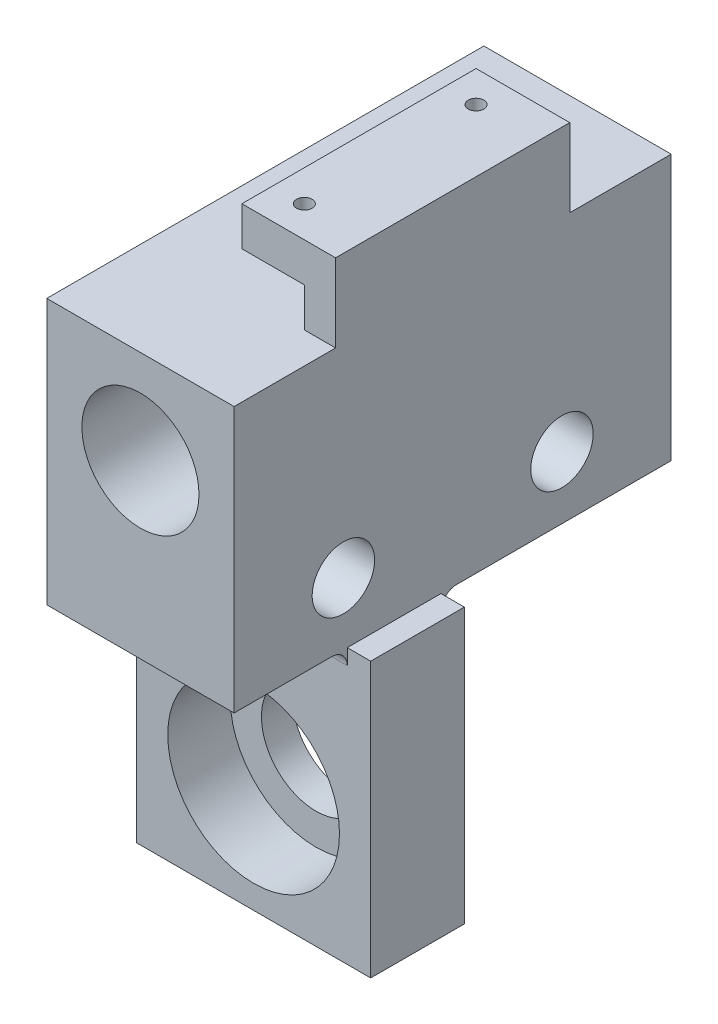
ISO-10303-21;
HEADER;
FILE_DESCRIPTION(('STEP AP214'),'2;1');
FILE_NAME('part.step','',(''),(''),'','','');
FILE_SCHEMA(('AUTOMOTIVE_DESIGN { 1 0 10303 214 1 1 1 1 }'));
ENDSEC;
DATA;
#1=APPLICATION_CONTEXT('core data for automotive mechanical design processes');
#2=APPLICATION_PROTOCOL_DEFINITION('international standard','automotive_design',2000,#1);
#3=PRODUCT_CONTEXT('',#1,'mechanical');
#4=PRODUCT('Part','Part','',(#3));
#5=PRODUCT_RELATED_PRODUCT_CATEGORY('part','',(#4));
#6=PRODUCT_DEFINITION_FORMATION('','',#4);
#7=PRODUCT_DEFINITION_CONTEXT('part definition',#1,'design');
#8=PRODUCT_DEFINITION('design','',#6,#7);
#9=PRODUCT_DEFINITION_SHAPE('','',#8);
#10=(LENGTH_UNIT() NAMED_UNIT(*) SI_UNIT(.MILLI.,.METRE.));
#11=(NAMED_UNIT(*) PLANE_ANGLE_UNIT() SI_UNIT($,.RADIAN.));
#12=(NAMED_UNIT(*) SI_UNIT($,.STERADIAN.) SOLID_ANGLE_UNIT());
#13=UNCERTAINTY_MEASURE_WITH_UNIT(LENGTH_MEASURE(1.E-05),#10,'distance_accuracy_value','');
#14=(GEOMETRIC_REPRESENTATION_CONTEXT(3) GLOBAL_UNCERTAINTY_ASSIGNED_CONTEXT((#13)) GLOBAL_UNIT_ASSIGNED_CONTEXT((#10,
#11,#12)) REPRESENTATION_CONTEXT('',''));
#15=CARTESIAN_POINT('',(0.,0.,0.));
#16=DIRECTION('',(0.,0.,1.));
#17=DIRECTION('',(1.,0.,0.));
#18=AXIS2_PLACEMENT_3D('',#15,#16,#17);
#19=CARTESIAN_POINT('',(-12.,12.,28.));
#20=DIRECTION('',(0.,-1.,0.));
#21=DIRECTION('',(0.,0.,-1.));
#22=AXIS2_PLACEMENT_3D('',#19,#20,#21);
#23=PLANE('',#22);
#24=DIRECTION('',(-1.,0.,0.));
#25=VECTOR('',#24,1.);
#26=CARTESIAN_POINT('',(-12.,12.,-28.));
#27=LINE('',#26,#25);
#28=CARTESIAN_POINT('',(12.,12.,-28.));
#29=VERTEX_POINT('',#28);
#30=CARTESIAN_POINT('',(-12.,12.,-28.));
#31=VERTEX_POINT('',#30);
#32=EDGE_CURVE('E260',#29,#31,#27,.T.);
#33=ORIENTED_EDGE('',*,*,#32,.T.);
#34=DIRECTION('',(0.,0.,-1.));
#35=VECTOR('',#34,1.);
#36=CARTESIAN_POINT('',(-12.,12.,28.));
#37=LINE('',#36,#35);
#38=CARTESIAN_POINT('',(-12.,12.,28.));
#39=VERTEX_POINT('',#38);
#40=EDGE_CURVE('E266',#39,#31,#37,.T.);
#41=ORIENTED_EDGE('',*,*,#40,.F.);
#42=DIRECTION('',(-1.,0.,0.));
#43=VECTOR('',#42,1.);
#44=CARTESIAN_POINT('',(-12.,12.,28.));
#45=LINE('',#44,#43);
#46=CARTESIAN_POINT('',(12.,12.,28.));
#47=VERTEX_POINT('',#46);
#48=EDGE_CURVE('E264',#47,#39,#45,.T.);
#49=ORIENTED_EDGE('',*,*,#48,.F.);
#50=DIRECTION('',(0.,0.,-1.));
#51=VECTOR('',#50,1.);
#52=CARTESIAN_POINT('',(12.,12.,28.));
#53=LINE('',#52,#51);
#54=CARTESIAN_POINT('',(12.,12.,15.));
#55=VERTEX_POINT('',#54);
#56=EDGE_CURVE('E187',#47,#55,#53,.T.);
#57=ORIENTED_EDGE('',*,*,#56,.T.);
#58=DIRECTION('',(1.,0.,0.));
#59=VECTOR('',#58,1.);
#60=CARTESIAN_POINT('',(0.,12.,15.));
#61=LINE('',#60,#59);
#62=CARTESIAN_POINT('',(8.,12.,15.));
#63=VERTEX_POINT('',#62);
#64=EDGE_CURVE('E181',#63,#55,#61,.T.);
#65=ORIENTED_EDGE('',*,*,#64,.F.);
#66=DIRECTION('',(0.,0.,1.));
#67=VECTOR('',#66,1.);
#68=CARTESIAN_POINT('',(8.,12.,-28.));
#69=LINE('',#68,#67);
#70=CARTESIAN_POINT('',(8.,12.,-15.));
#71=VERTEX_POINT('',#70);
#72=EDGE_CURVE('E48',#71,#63,#69,.T.);
#73=ORIENTED_EDGE('',*,*,#72,.F.);
#74=DIRECTION('',(-1.,0.,0.));
#75=VECTOR('',#74,1.);
#76=CARTESIAN_POINT('',(0.,12.,-15.));
#77=LINE('',#76,#75);
#78=CARTESIAN_POINT('',(12.,12.,-15.));
#79=VERTEX_POINT('',#78);
#80=EDGE_CURVE('E53',#79,#71,#77,.T.);
#81=ORIENTED_EDGE('',*,*,#80,.F.);
#82=EDGE_CURVE('E278',#79,#29,#53,.T.);
#83=ORIENTED_EDGE('',*,*,#82,.T.);
#84=EDGE_LOOP('',(#33,#41,#49,#57,#65,#73,#81,#83));
#85=FACE_BOUND('',#84,.T.);
#86=ADVANCED_FACE('F33',(#85),#23,.F.);
#87=CARTESIAN_POINT('',(-12.,-22.,28.));
#88=DIRECTION('',(0.,1.,0.));
#89=DIRECTION('',(0.,0.,1.));
#90=AXIS2_PLACEMENT_3D('',#87,#88,#89);
#91=PLANE('',#90);
#92=DIRECTION('',(0.,0.,-1.));
#93=VECTOR('',#92,1.);
#94=CARTESIAN_POINT('',(-12.,-22.,28.));
#95=LINE('',#94,#93);
#96=CARTESIAN_POINT('',(-12.,-22.,28.));
#97=VERTEX_POINT('',#96);
#98=CARTESIAN_POINT('',(-12.,-22.,15.5));
#99=VERTEX_POINT('',#98);
#100=EDGE_CURVE('E286',#97,#99,#95,.T.);
#101=ORIENTED_EDGE('',*,*,#100,.T.);
#102=DIRECTION('',(-1.,0.,0.));
#103=VECTOR('',#102,1.);
#104=CARTESIAN_POINT('',(12.,-22.,15.5));
#105=LINE('',#104,#103);
#106=CARTESIAN_POINT('',(12.,-22.,15.5));
#107=VERTEX_POINT('',#106);
#108=EDGE_CURVE('E308',#99,#107,#105,.F.);
#109=ORIENTED_EDGE('',*,*,#108,.T.);
#110=DIRECTION('',(0.,0.,-1.));
#111=VECTOR('',#110,1.);
#112=CARTESIAN_POINT('',(12.,-22.,28.));
#113=LINE('',#112,#111);
#114=CARTESIAN_POINT('',(12.,-22.,28.));
#115=VERTEX_POINT('',#114);
#116=EDGE_CURVE('E281',#115,#107,#113,.T.);
#117=ORIENTED_EDGE('',*,*,#116,.F.);
#118=DIRECTION('',(1.,0.,0.));
#119=VECTOR('',#118,1.);
#120=CARTESIAN_POINT('',(-12.,-22.,28.));
#121=LINE('',#120,#119);
#122=EDGE_CURVE('E259',#97,#115,#121,.T.);
#123=ORIENTED_EDGE('',*,*,#122,.F.);
#124=EDGE_LOOP('',(#101,#109,#117,#123));
#125=FACE_BOUND('',#124,.T.);
#126=ADVANCED_FACE('F368',(#125),#91,.F.);
#127=CARTESIAN_POINT('',(12.,-22.,-0.5));
#128=VERTEX_POINT('',#127);
#129=CARTESIAN_POINT('',(12.,-22.,-28.));
#130=VERTEX_POINT('',#129);
#131=EDGE_CURVE('E280',#128,#130,#113,.T.);
#132=ORIENTED_EDGE('',*,*,#131,.F.);
#133=DIRECTION('',(1.,0.,0.));
#134=VECTOR('',#133,1.);
#135=CARTESIAN_POINT('',(-12.,-22.,-0.5));
#136=LINE('',#135,#134);
#137=CARTESIAN_POINT('',(-12.,-22.,-0.5));
#138=VERTEX_POINT('',#137);
#139=EDGE_CURVE('E298',#128,#138,#136,.F.);
#140=ORIENTED_EDGE('',*,*,#139,.T.);
#141=CARTESIAN_POINT('',(-12.,-22.,-28.));
#142=VERTEX_POINT('',#141);
#143=EDGE_CURVE('E284',#138,#142,#95,.T.);
#144=ORIENTED_EDGE('',*,*,#143,.T.);
#145=DIRECTION('',(1.,0.,0.));
#146=VECTOR('',#145,1.);
#147=CARTESIAN_POINT('',(-12.,-22.,-28.));
#148=LINE('',#147,#146);
#149=EDGE_CURVE('E269',#142,#130,#148,.T.);
#150=ORIENTED_EDGE('',*,*,#149,.T.);
#151=EDGE_LOOP('',(#132,#140,#144,#150));
#152=FACE_BOUND('',#151,.T.);
#153=ADVANCED_FACE('F341',(#152),#91,.F.);
#154=CARTESIAN_POINT('',(0.,0.,28.));
#155=DIRECTION('',(0.,0.,1.));
#156=DIRECTION('',(1.,0.,0.));
#157=AXIS2_PLACEMENT_3D('',#154,#155,#156);
#158=PLANE('',#157);
#159=DIRECTION('',(0.,-1.,0.));
#160=VECTOR('',#159,1.);
#161=CARTESIAN_POINT('',(-12.,12.,28.));
#162=LINE('',#161,#160);
#163=EDGE_CURVE('E256',#39,#97,#162,.T.);
#164=ORIENTED_EDGE('',*,*,#163,.T.);
#165=ORIENTED_EDGE('',*,*,#122,.T.);
#166=DIRECTION('',(0.,1.,0.));
#167=VECTOR('',#166,1.);
#168=CARTESIAN_POINT('',(12.,12.,28.));
#169=LINE('',#168,#167);
#170=EDGE_CURVE('E262',#115,#47,#169,.T.);
#171=ORIENTED_EDGE('',*,*,#170,.T.);
#172=ORIENTED_EDGE('',*,*,#48,.T.);
#173=EDGE_LOOP('',(#164,#165,#171,#172));
#174=FACE_BOUND('',#173,.T.);
#175=CARTESIAN_POINT('',(0.,0.,28.));
#176=DIRECTION('',(0.,0.,1.));
#177=DIRECTION('',(1.,0.,0.));
#178=AXIS2_PLACEMENT_3D('',#175,#176,#177);
#179=CIRCLE('',#178,7.5);
#180=CARTESIAN_POINT('',(7.5,0.,28.));
#181=VERTEX_POINT('',#180);
#182=EDGE_CURVE('E250',#181,#181,#179,.T.);
#183=ORIENTED_EDGE('',*,*,#182,.F.);
#184=EDGE_LOOP('',(#183));
#185=FACE_BOUND('',#184,.T.);
#186=ADVANCED_FACE('F372',(#174,#185),#158,.T.);
#187=CARTESIAN_POINT('',(0.,0.,-28.));
#188=DIRECTION('',(0.,0.,1.));
#189=DIRECTION('',(1.,0.,0.));
#190=AXIS2_PLACEMENT_3D('',#187,#188,#189);
#191=PLANE('',#190);
#192=DIRECTION('',(0.,-1.,0.));
#193=VECTOR('',#192,1.);
#194=CARTESIAN_POINT('',(-12.,12.,-28.));
#195=LINE('',#194,#193);
#196=EDGE_CURVE('E253',#31,#142,#195,.T.);
#197=ORIENTED_EDGE('',*,*,#196,.F.);
#198=ORIENTED_EDGE('',*,*,#32,.F.);
#199=DIRECTION('',(0.,1.,0.));
#200=VECTOR('',#199,1.);
#201=CARTESIAN_POINT('',(12.,12.,-28.));
#202=LINE('',#201,#200);
#203=EDGE_CURVE('E272',#130,#29,#202,.T.);
#204=ORIENTED_EDGE('',*,*,#203,.F.);
#205=ORIENTED_EDGE('',*,*,#149,.F.);
#206=EDGE_LOOP('',(#197,#198,#204,#205));
#207=FACE_BOUND('',#206,.T.);
#208=CARTESIAN_POINT('',(0.,0.,-28.));
#209=DIRECTION('',(0.,0.,1.));
#210=DIRECTION('',(1.,0.,0.));
#211=AXIS2_PLACEMENT_3D('',#208,#209,#210);
#212=CIRCLE('',#211,7.5);
#213=CARTESIAN_POINT('',(7.5,0.,-28.));
#214=VERTEX_POINT('',#213);
#215=EDGE_CURVE('E249',#214,#214,#212,.T.);
#216=ORIENTED_EDGE('',*,*,#215,.T.);
#217=EDGE_LOOP('',(#216));
#218=FACE_BOUND('',#217,.T.);
#219=ADVANCED_FACE('F337',(#207,#218),#191,.F.);
#220=CARTESIAN_POINT('',(-12.,12.,28.));
#221=DIRECTION('',(1.,0.,0.));
#222=DIRECTION('',(0.,1.,0.));
#223=AXIS2_PLACEMENT_3D('',#220,#221,#222);
#224=PLANE('',#223);
#225=ORIENTED_EDGE('',*,*,#196,.T.);
#226=ORIENTED_EDGE('',*,*,#143,.F.);
#227=CARTESIAN_POINT('',(-12.,-24.,-0.5));
#228=DIRECTION('',(1.,0.,0.));
#229=DIRECTION('',(0.,1.,0.));
#230=AXIS2_PLACEMENT_3D('',#227,#228,#229);
#231=CIRCLE('',#230,2.);
#232=CARTESIAN_POINT('',(-12.,-24.,1.5));
#233=VERTEX_POINT('',#232);
#234=EDGE_CURVE('E312',#138,#233,#231,.T.);
#235=ORIENTED_EDGE('',*,*,#234,.T.);
#236=DIRECTION('',(0.,-1.,0.));
#237=VECTOR('',#236,1.);
#238=CARTESIAN_POINT('',(-12.,12.,1.5));
#239=LINE('',#238,#237);
#240=CARTESIAN_POINT('',(-12.,-22.,1.5));
#241=VERTEX_POINT('',#240);
#242=EDGE_CURVE('E289',#241,#233,#239,.T.);
#243=ORIENTED_EDGE('',*,*,#242,.F.);
#244=CARTESIAN_POINT('',(-12.,-22.,13.5));
#245=VERTEX_POINT('',#244);
#246=EDGE_CURVE('E290',#245,#241,#95,.T.);
#247=ORIENTED_EDGE('',*,*,#246,.F.);
#248=DIRECTION('',(0.,1.,0.));
#249=VECTOR('',#248,1.);
#250=CARTESIAN_POINT('',(-12.,12.,13.5));
#251=LINE('',#250,#249);
#252=CARTESIAN_POINT('',(-12.,-24.,13.5));
#253=VERTEX_POINT('',#252);
#254=EDGE_CURVE('E306',#253,#245,#251,.T.);
#255=ORIENTED_EDGE('',*,*,#254,.F.);
#256=CARTESIAN_POINT('',(-12.,-24.,15.5));
#257=DIRECTION('',(1.,0.,0.));
#258=DIRECTION('',(0.,1.,0.));
#259=AXIS2_PLACEMENT_3D('',#256,#257,#258);
#260=CIRCLE('',#259,2.);
#261=EDGE_CURVE('E314',#253,#99,#260,.T.);
#262=ORIENTED_EDGE('',*,*,#261,.T.);
#263=ORIENTED_EDGE('',*,*,#100,.F.);
#264=ORIENTED_EDGE('',*,*,#163,.F.);
#265=ORIENTED_EDGE('',*,*,#40,.T.);
#266=EDGE_LOOP('',(#225,#226,#235,#243,#247,#255,#262,#263,#264,#265));
#267=FACE_BOUND('',#266,.T.);
#268=ADVANCED_FACE('F333',(#267),#224,.F.);
#269=CARTESIAN_POINT('',(12.,12.,28.));
#270=DIRECTION('',(-1.,0.,0.));
#271=DIRECTION('',(0.,-1.,0.));
#272=AXIS2_PLACEMENT_3D('',#269,#270,#271);
#273=PLANE('',#272);
#274=CARTESIAN_POINT('',(12.,-14.,-14.));
#275=DIRECTION('',(1.,0.,0.));
#276=DIRECTION('',(0.,1.,0.));
#277=AXIS2_PLACEMENT_3D('',#274,#275,#276);
#278=CIRCLE('',#277,4.);
#279=CARTESIAN_POINT('',(12.,-10.,-14.));
#280=VERTEX_POINT('',#279);
#281=EDGE_CURVE('E407',#280,#280,#278,.T.);
#282=ORIENTED_EDGE('',*,*,#281,.F.);
#283=EDGE_LOOP('',(#282));
#284=FACE_BOUND('',#283,.T.);
#285=CARTESIAN_POINT('',(12.,-14.,14.));
#286=DIRECTION('',(1.,0.,0.));
#287=DIRECTION('',(0.,1.,0.));
#288=AXIS2_PLACEMENT_3D('',#285,#286,#287);
#289=CIRCLE('',#288,4.);
#290=CARTESIAN_POINT('',(12.,-10.,14.));
#291=VERTEX_POINT('',#290);
#292=EDGE_CURVE('E401',#291,#291,#289,.T.);
#293=ORIENTED_EDGE('',*,*,#292,.F.);
#294=EDGE_LOOP('',(#293));
#295=FACE_BOUND('',#294,.T.);
#296=ORIENTED_EDGE('',*,*,#203,.T.);
#297=ORIENTED_EDGE('',*,*,#82,.F.);
#298=DIRECTION('',(0.,-1.,0.));
#299=VECTOR('',#298,1.);
#300=CARTESIAN_POINT('',(12.,22.,-15.));
#301=LINE('',#300,#299);
#302=CARTESIAN_POINT('',(12.,22.,-15.));
#303=VERTEX_POINT('',#302);
#304=EDGE_CURVE('E202',#303,#79,#301,.T.);
#305=ORIENTED_EDGE('',*,*,#304,.F.);
#306=DIRECTION('',(0.,0.,-1.));
#307=VECTOR('',#306,1.);
#308=CARTESIAN_POINT('',(12.,22.,-15.));
#309=LINE('',#308,#307);
#310=CARTESIAN_POINT('',(12.,22.,15.));
#311=VERTEX_POINT('',#310);
#312=EDGE_CURVE('E325',#311,#303,#309,.T.);
#313=ORIENTED_EDGE('',*,*,#312,.F.);
#314=DIRECTION('',(0.,-1.,0.));
#315=VECTOR('',#314,1.);
#316=CARTESIAN_POINT('',(12.,22.,15.));
#317=LINE('',#316,#315);
#318=EDGE_CURVE('E205',#311,#55,#317,.T.);
#319=ORIENTED_EDGE('',*,*,#318,.T.);
#320=ORIENTED_EDGE('',*,*,#56,.F.);
#321=ORIENTED_EDGE('',*,*,#170,.F.);
#322=ORIENTED_EDGE('',*,*,#116,.T.);
#323=CARTESIAN_POINT('',(12.,-24.,15.5));
#324=DIRECTION('',(-1.,0.,0.));
#325=DIRECTION('',(0.,-1.,0.));
#326=AXIS2_PLACEMENT_3D('',#323,#324,#325);
#327=CIRCLE('',#326,2.);
#328=CARTESIAN_POINT('',(12.,-24.,13.5));
#329=VERTEX_POINT('',#328);
#330=EDGE_CURVE('E316',#107,#329,#327,.T.);
#331=ORIENTED_EDGE('',*,*,#330,.T.);
#332=DIRECTION('',(0.,-1.,0.));
#333=VECTOR('',#332,1.);
#334=CARTESIAN_POINT('',(12.,12.,13.5));
#335=LINE('',#334,#333);
#336=CARTESIAN_POINT('',(12.,-22.,13.5));
#337=VERTEX_POINT('',#336);
#338=EDGE_CURVE('E300',#337,#329,#335,.T.);
#339=ORIENTED_EDGE('',*,*,#338,.F.);
#340=CARTESIAN_POINT('',(12.,-22.,1.5));
#341=VERTEX_POINT('',#340);
#342=EDGE_CURVE('E285',#337,#341,#113,.T.);
#343=ORIENTED_EDGE('',*,*,#342,.T.);
#344=DIRECTION('',(0.,1.,0.));
#345=VECTOR('',#344,1.);
#346=CARTESIAN_POINT('',(12.,12.,1.5));
#347=LINE('',#346,#345);
#348=CARTESIAN_POINT('',(12.,-24.,1.5));
#349=VERTEX_POINT('',#348);
#350=EDGE_CURVE('E296',#349,#341,#347,.T.);
#351=ORIENTED_EDGE('',*,*,#350,.F.);
#352=CARTESIAN_POINT('',(12.,-24.,-0.5));
#353=DIRECTION('',(-1.,0.,0.));
#354=DIRECTION('',(0.,-1.,0.));
#355=AXIS2_PLACEMENT_3D('',#352,#353,#354);
#356=CIRCLE('',#355,2.);
#357=EDGE_CURVE('E310',#349,#128,#356,.T.);
#358=ORIENTED_EDGE('',*,*,#357,.T.);
#359=ORIENTED_EDGE('',*,*,#131,.T.);
#360=EDGE_LOOP('',(#296,#297,#305,#313,#319,#320,#321,#322,#331,#339,#343,#351,#358,#359));
#361=FACE_BOUND('',#360,.T.);
#362=ADVANCED_FACE('F324',(#284,#295,#361),#273,.F.);
#363=CARTESIAN_POINT('',(0.,0.,28.));
#364=DIRECTION('',(0.,0.,-1.));
#365=DIRECTION('',(-1.,0.,0.));
#366=AXIS2_PLACEMENT_3D('',#363,#364,#365);
#367=CYLINDRICAL_SURFACE('',#366,7.5);
#368=ORIENTED_EDGE('',*,*,#182,.T.);
#369=EDGE_LOOP('',(#368));
#370=FACE_BOUND('',#369,.T.);
#371=ORIENTED_EDGE('',*,*,#215,.F.);
#372=EDGE_LOOP('',(#371));
#373=FACE_BOUND('',#372,.T.);
#374=ADVANCED_FACE('F459',(#370,#373),#367,.F.);
#375=CARTESIAN_POINT('',(0.,-22.,0.));
#376=DIRECTION('',(0.,-1.,0.));
#377=DIRECTION('',(0.,0.,-1.));
#378=AXIS2_PLACEMENT_3D('',#375,#376,#377);
#379=PLANE('',#378);
#380=DIRECTION('',(-1.,0.,0.));
#381=VECTOR('',#380,1.);
#382=CARTESIAN_POINT('',(-15.,-22.,13.5));
#383=LINE('',#382,#381);
#384=CARTESIAN_POINT('',(-15.,-22.,13.5));
#385=VERTEX_POINT('',#384);
#386=EDGE_CURVE('E235',#245,#385,#383,.T.);
#387=ORIENTED_EDGE('',*,*,#386,.F.);
#388=ORIENTED_EDGE('',*,*,#246,.T.);
#389=DIRECTION('',(1.,0.,0.));
#390=VECTOR('',#389,1.);
#391=CARTESIAN_POINT('',(-15.,-22.,1.5));
#392=LINE('',#391,#390);
#393=CARTESIAN_POINT('',(-15.,-22.,1.5));
#394=VERTEX_POINT('',#393);
#395=EDGE_CURVE('E230',#394,#241,#392,.T.);
#396=ORIENTED_EDGE('',*,*,#395,.F.);
#397=DIRECTION('',(0.,0.,-1.));
#398=VECTOR('',#397,1.);
#399=CARTESIAN_POINT('',(-15.,-22.,13.5));
#400=LINE('',#399,#398);
#401=EDGE_CURVE('E213',#385,#394,#400,.T.);
#402=ORIENTED_EDGE('',*,*,#401,.F.);
#403=EDGE_LOOP('',(#387,#388,#396,#402));
#404=FACE_BOUND('',#403,.T.);
#405=ADVANCED_FACE('F348',(#404),#379,.F.);
#406=CARTESIAN_POINT('',(-15.,-57.15,13.5));
#407=DIRECTION('',(1.,0.,0.));
#408=DIRECTION('',(0.,0.,-1.));
#409=AXIS2_PLACEMENT_3D('',#406,#407,#408);
#410=PLANE('',#409);
#411=ORIENTED_EDGE('',*,*,#401,.T.);
#412=DIRECTION('',(0.,1.,0.));
#413=VECTOR('',#412,1.);
#414=CARTESIAN_POINT('',(-15.,-57.15,1.5));
#415=LINE('',#414,#413);
#416=CARTESIAN_POINT('',(-15.,-57.15,1.5));
#417=VERTEX_POINT('',#416);
#418=EDGE_CURVE('E246',#417,#394,#415,.T.);
#419=ORIENTED_EDGE('',*,*,#418,.F.);
#420=DIRECTION('',(0.,0.,-1.));
#421=VECTOR('',#420,1.);
#422=CARTESIAN_POINT('',(-15.,-57.15,13.5));
#423=LINE('',#422,#421);
#424=CARTESIAN_POINT('',(-15.,-57.15,13.5));
#425=VERTEX_POINT('',#424);
#426=EDGE_CURVE('E216',#425,#417,#423,.T.);
#427=ORIENTED_EDGE('',*,*,#426,.F.);
#428=DIRECTION('',(0.,1.,0.));
#429=VECTOR('',#428,1.);
#430=CARTESIAN_POINT('',(-15.,-57.15,13.5));
#431=LINE('',#430,#429);
#432=EDGE_CURVE('E226',#425,#385,#431,.T.);
#433=ORIENTED_EDGE('',*,*,#432,.T.);
#434=EDGE_LOOP('',(#411,#419,#427,#433));
#435=FACE_BOUND('',#434,.T.);
#436=ADVANCED_FACE('F358',(#435),#410,.F.);
#437=CARTESIAN_POINT('',(-15.,-57.15,1.5));
#438=DIRECTION('',(0.,0.,1.));
#439=DIRECTION('',(1.,0.,0.));
#440=AXIS2_PLACEMENT_3D('',#437,#438,#439);
#441=PLANE('',#440);
#442=CARTESIAN_POINT('',(0.,-43.15,1.5));
#443=DIRECTION('',(0.,0.,1.));
#444=DIRECTION('',(1.,0.,0.));
#445=AXIS2_PLACEMENT_3D('',#442,#443,#444);
#446=CIRCLE('',#445,7.);
#447=CARTESIAN_POINT('',(7.,-43.15,1.5));
#448=VERTEX_POINT('',#447);
#449=EDGE_CURVE('E410',#448,#448,#446,.T.);
#450=ORIENTED_EDGE('',*,*,#449,.T.);
#451=EDGE_LOOP('',(#450));
#452=FACE_BOUND('',#451,.T.);
#453=DIRECTION('',(1.,0.,0.));
#454=VECTOR('',#453,1.);
#455=CARTESIAN_POINT('',(12.,-24.,1.5));
#456=LINE('',#455,#454);
#457=EDGE_CURVE('E293',#233,#349,#456,.T.);
#458=ORIENTED_EDGE('',*,*,#457,.T.);
#459=ORIENTED_EDGE('',*,*,#350,.T.);
#460=CARTESIAN_POINT('',(15.,-22.,1.5));
#461=VERTEX_POINT('',#460);
#462=EDGE_CURVE('E229',#341,#461,#392,.T.);
#463=ORIENTED_EDGE('',*,*,#462,.T.);
#464=DIRECTION('',(0.,1.,0.));
#465=VECTOR('',#464,1.);
#466=CARTESIAN_POINT('',(15.,-57.15,1.5));
#467=LINE('',#466,#465);
#468=CARTESIAN_POINT('',(15.,-57.15,1.5));
#469=VERTEX_POINT('',#468);
#470=EDGE_CURVE('E243',#469,#461,#467,.T.);
#471=ORIENTED_EDGE('',*,*,#470,.F.);
#472=DIRECTION('',(1.,0.,0.));
#473=VECTOR('',#472,1.);
#474=CARTESIAN_POINT('',(-15.,-57.15,1.5));
#475=LINE('',#474,#473);
#476=EDGE_CURVE('E219',#417,#469,#475,.T.);
#477=ORIENTED_EDGE('',*,*,#476,.F.);
#478=ORIENTED_EDGE('',*,*,#418,.T.);
#479=ORIENTED_EDGE('',*,*,#395,.T.);
#480=ORIENTED_EDGE('',*,*,#242,.T.);
#481=EDGE_LOOP('',(#458,#459,#463,#471,#477,#478,#479,#480));
#482=FACE_BOUND('',#481,.T.);
#483=ADVANCED_FACE('F353',(#452,#482),#441,.F.);
#484=CARTESIAN_POINT('',(15.,-57.15,13.5));
#485=DIRECTION('',(-1.,0.,0.));
#486=DIRECTION('',(0.,0.,1.));
#487=AXIS2_PLACEMENT_3D('',#484,#485,#486);
#488=PLANE('',#487);
#489=DIRECTION('',(0.,0.,1.));
#490=VECTOR('',#489,1.);
#491=CARTESIAN_POINT('',(15.,-22.,13.5));
#492=LINE('',#491,#490);
#493=CARTESIAN_POINT('',(15.,-22.,13.5));
#494=VERTEX_POINT('',#493);
#495=EDGE_CURVE('E233',#461,#494,#492,.T.);
#496=ORIENTED_EDGE('',*,*,#495,.T.);
#497=DIRECTION('',(0.,1.,0.));
#498=VECTOR('',#497,1.);
#499=CARTESIAN_POINT('',(15.,-57.15,13.5));
#500=LINE('',#499,#498);
#501=CARTESIAN_POINT('',(15.,-57.15,13.5));
#502=VERTEX_POINT('',#501);
#503=EDGE_CURVE('E240',#502,#494,#500,.T.);
#504=ORIENTED_EDGE('',*,*,#503,.F.);
#505=DIRECTION('',(0.,0.,1.));
#506=VECTOR('',#505,1.);
#507=CARTESIAN_POINT('',(15.,-57.15,13.5));
#508=LINE('',#507,#506);
#509=EDGE_CURVE('E222',#469,#502,#508,.T.);
#510=ORIENTED_EDGE('',*,*,#509,.F.);
#511=ORIENTED_EDGE('',*,*,#470,.T.);
#512=EDGE_LOOP('',(#496,#504,#510,#511));
#513=FACE_BOUND('',#512,.T.);
#514=ADVANCED_FACE('F438',(#513),#488,.F.);
#515=CARTESIAN_POINT('',(-15.,-57.15,13.5));
#516=DIRECTION('',(0.,0.,-1.));
#517=DIRECTION('',(-1.,0.,0.));
#518=AXIS2_PLACEMENT_3D('',#515,#516,#517);
#519=PLANE('',#518);
#520=CARTESIAN_POINT('',(0.,-43.15,13.5));
#521=DIRECTION('',(0.,0.,1.));
#522=DIRECTION('',(1.,0.,0.));
#523=AXIS2_PLACEMENT_3D('',#520,#521,#522);
#524=CIRCLE('',#523,11.);
#525=CARTESIAN_POINT('',(11.,-43.15,13.5));
#526=VERTEX_POINT('',#525);
#527=EDGE_CURVE('E209',#526,#526,#524,.T.);
#528=ORIENTED_EDGE('',*,*,#527,.F.);
#529=EDGE_LOOP('',(#528));
#530=FACE_BOUND('',#529,.T.);
#531=DIRECTION('',(-1.,0.,0.));
#532=VECTOR('',#531,1.);
#533=CARTESIAN_POINT('',(-12.,-24.,13.5));
#534=LINE('',#533,#532);
#535=EDGE_CURVE('E303',#329,#253,#534,.T.);
#536=ORIENTED_EDGE('',*,*,#535,.T.);
#537=ORIENTED_EDGE('',*,*,#254,.T.);
#538=ORIENTED_EDGE('',*,*,#386,.T.);
#539=ORIENTED_EDGE('',*,*,#432,.F.);
#540=DIRECTION('',(-1.,0.,0.));
#541=VECTOR('',#540,1.);
#542=CARTESIAN_POINT('',(-15.,-57.15,13.5));
#543=LINE('',#542,#541);
#544=EDGE_CURVE('E224',#502,#425,#543,.T.);
#545=ORIENTED_EDGE('',*,*,#544,.F.);
#546=ORIENTED_EDGE('',*,*,#503,.T.);
#547=EDGE_CURVE('E220',#494,#337,#383,.T.);
#548=ORIENTED_EDGE('',*,*,#547,.T.);
#549=ORIENTED_EDGE('',*,*,#338,.T.);
#550=EDGE_LOOP('',(#536,#537,#538,#539,#545,#546,#548,#549));
#551=FACE_BOUND('',#550,.T.);
#552=ADVANCED_FACE('F362',(#530,#551),#519,.F.);
#553=CARTESIAN_POINT('',(0.,-57.15,0.));
#554=DIRECTION('',(0.,-1.,0.));
#555=DIRECTION('',(0.,0.,-1.));
#556=AXIS2_PLACEMENT_3D('',#553,#554,#555);
#557=PLANE('',#556);
#558=ORIENTED_EDGE('',*,*,#426,.T.);
#559=ORIENTED_EDGE('',*,*,#476,.T.);
#560=ORIENTED_EDGE('',*,*,#509,.T.);
#561=ORIENTED_EDGE('',*,*,#544,.T.);
#562=EDGE_LOOP('',(#558,#559,#560,#561));
#563=FACE_BOUND('',#562,.T.);
#564=ADVANCED_FACE('F437',(#563),#557,.T.);
#565=ORIENTED_EDGE('',*,*,#342,.F.);
#566=ORIENTED_EDGE('',*,*,#547,.F.);
#567=ORIENTED_EDGE('',*,*,#495,.F.);
#568=ORIENTED_EDGE('',*,*,#462,.F.);
#569=EDGE_LOOP('',(#565,#566,#567,#568));
#570=FACE_BOUND('',#569,.T.);
#571=ADVANCED_FACE('F432',(#570),#379,.F.);
#572=CARTESIAN_POINT('',(0.,-43.15,5.5));
#573=DIRECTION('',(0.,0.,1.));
#574=DIRECTION('',(1.,0.,0.));
#575=AXIS2_PLACEMENT_3D('',#572,#573,#574);
#576=CYLINDRICAL_SURFACE('',#575,11.);
#577=CARTESIAN_POINT('',(0.,-43.15,5.5));
#578=DIRECTION('',(0.,0.,1.));
#579=DIRECTION('',(1.,0.,0.));
#580=AXIS2_PLACEMENT_3D('',#577,#578,#579);
#581=CIRCLE('',#580,11.);
#582=CARTESIAN_POINT('',(11.,-43.15,5.5));
#583=VERTEX_POINT('',#582);
#584=EDGE_CURVE('E210',#583,#583,#581,.T.);
#585=ORIENTED_EDGE('',*,*,#584,.F.);
#586=EDGE_LOOP('',(#585));
#587=FACE_BOUND('',#586,.T.);
#588=ORIENTED_EDGE('',*,*,#527,.T.);
#589=EDGE_LOOP('',(#588));
#590=FACE_BOUND('',#589,.T.);
#591=ADVANCED_FACE('F426',(#587,#590),#576,.F.);
#592=CARTESIAN_POINT('',(0.,-43.15,5.5));
#593=DIRECTION('',(0.,0.,1.));
#594=DIRECTION('',(1.,0.,0.));
#595=AXIS2_PLACEMENT_3D('',#592,#593,#594);
#596=PLANE('',#595);
#597=CARTESIAN_POINT('',(0.,-43.15,5.5));
#598=DIRECTION('',(0.,0.,1.));
#599=DIRECTION('',(1.,0.,0.));
#600=AXIS2_PLACEMENT_3D('',#597,#598,#599);
#601=CIRCLE('',#600,7.);
#602=CARTESIAN_POINT('',(7.,-43.15,5.5));
#603=VERTEX_POINT('',#602);
#604=EDGE_CURVE('E415',#603,#603,#601,.T.);
#605=ORIENTED_EDGE('',*,*,#604,.F.);
#606=EDGE_LOOP('',(#605));
#607=FACE_BOUND('',#606,.T.);
#608=ORIENTED_EDGE('',*,*,#584,.T.);
#609=EDGE_LOOP('',(#608));
#610=FACE_BOUND('',#609,.T.);
#611=ADVANCED_FACE('F422',(#607,#610),#596,.T.);
#612=CARTESIAN_POINT('',(-15.,-24.,-0.5));
#613=DIRECTION('',(-1.,0.,0.));
#614=DIRECTION('',(0.,0.,1.));
#615=AXIS2_PLACEMENT_3D('',#612,#613,#614);
#616=CYLINDRICAL_SURFACE('',#615,2.);
#617=ORIENTED_EDGE('',*,*,#234,.F.);
#618=ORIENTED_EDGE('',*,*,#139,.F.);
#619=ORIENTED_EDGE('',*,*,#357,.F.);
#620=ORIENTED_EDGE('',*,*,#457,.F.);
#621=EDGE_LOOP('',(#617,#618,#619,#620));
#622=FACE_BOUND('',#621,.T.);
#623=ADVANCED_FACE('F425',(#622),#616,.F.);
#624=CARTESIAN_POINT('',(-15.,-24.,15.5));
#625=DIRECTION('',(1.,0.,0.));
#626=DIRECTION('',(0.,0.,-1.));
#627=AXIS2_PLACEMENT_3D('',#624,#625,#626);
#628=CYLINDRICAL_SURFACE('',#627,2.);
#629=ORIENTED_EDGE('',*,*,#330,.F.);
#630=ORIENTED_EDGE('',*,*,#108,.F.);
#631=ORIENTED_EDGE('',*,*,#261,.F.);
#632=ORIENTED_EDGE('',*,*,#535,.F.);
#633=EDGE_LOOP('',(#629,#630,#631,#632));
#634=FACE_BOUND('',#633,.T.);
#635=ADVANCED_FACE('F35',(#634),#628,.F.);
#636=CARTESIAN_POINT('',(0.,22.,-15.));
#637=DIRECTION('',(1.,0.,0.));
#638=DIRECTION('',(0.,0.,-1.));
#639=AXIS2_PLACEMENT_3D('',#636,#637,#638);
#640=PLANE('',#639);
#641=DIRECTION('',(0.,-1.,0.));
#642=VECTOR('',#641,1.);
#643=CARTESIAN_POINT('',(0.,22.,-15.));
#644=LINE('',#643,#642);
#645=CARTESIAN_POINT('',(0.,22.,-15.));
#646=VERTEX_POINT('',#645);
#647=CARTESIAN_POINT('',(0.,17.,-15.));
#648=VERTEX_POINT('',#647);
#649=EDGE_CURVE('E199',#646,#648,#644,.T.);
#650=ORIENTED_EDGE('',*,*,#649,.T.);
#651=DIRECTION('',(0.,0.,1.));
#652=VECTOR('',#651,1.);
#653=CARTESIAN_POINT('',(0.,17.,-28.));
#654=LINE('',#653,#652);
#655=CARTESIAN_POINT('',(0.,17.,15.));
#656=VERTEX_POINT('',#655);
#657=EDGE_CURVE('E189',#648,#656,#654,.T.);
#658=ORIENTED_EDGE('',*,*,#657,.T.);
#659=DIRECTION('',(0.,-1.,0.));
#660=VECTOR('',#659,1.);
#661=CARTESIAN_POINT('',(0.,22.,15.));
#662=LINE('',#661,#660);
#663=CARTESIAN_POINT('',(0.,22.,15.));
#664=VERTEX_POINT('',#663);
#665=EDGE_CURVE('E207',#664,#656,#662,.T.);
#666=ORIENTED_EDGE('',*,*,#665,.F.);
#667=DIRECTION('',(0.,0.,1.));
#668=VECTOR('',#667,1.);
#669=CARTESIAN_POINT('',(0.,22.,-15.));
#670=LINE('',#669,#668);
#671=EDGE_CURVE('E191',#646,#664,#670,.T.);
#672=ORIENTED_EDGE('',*,*,#671,.F.);
#673=EDGE_LOOP('',(#650,#658,#666,#672));
#674=FACE_BOUND('',#673,.T.);
#675=ADVANCED_FACE('F383',(#674),#640,.F.);
#676=CARTESIAN_POINT('',(0.,22.,15.));
#677=DIRECTION('',(0.,0.,-1.));
#678=DIRECTION('',(-1.,0.,0.));
#679=AXIS2_PLACEMENT_3D('',#676,#677,#678);
#680=PLANE('',#679);
#681=ORIENTED_EDGE('',*,*,#665,.T.);
#682=DIRECTION('',(-1.,0.,0.));
#683=VECTOR('',#682,1.);
#684=CARTESIAN_POINT('',(0.,17.,15.));
#685=LINE('',#684,#683);
#686=CARTESIAN_POINT('',(8.,17.,15.));
#687=VERTEX_POINT('',#686);
#688=EDGE_CURVE('E175',#687,#656,#685,.T.);
#689=ORIENTED_EDGE('',*,*,#688,.F.);
#690=DIRECTION('',(0.,1.,0.));
#691=VECTOR('',#690,1.);
#692=CARTESIAN_POINT('',(8.,17.,15.));
#693=LINE('',#692,#691);
#694=EDGE_CURVE('E171',#63,#687,#693,.T.);
#695=ORIENTED_EDGE('',*,*,#694,.F.);
#696=ORIENTED_EDGE('',*,*,#64,.T.);
#697=ORIENTED_EDGE('',*,*,#318,.F.);
#698=DIRECTION('',(1.,0.,0.));
#699=VECTOR('',#698,1.);
#700=CARTESIAN_POINT('',(0.,22.,15.));
#701=LINE('',#700,#699);
#702=EDGE_CURVE('E374',#664,#311,#701,.T.);
#703=ORIENTED_EDGE('',*,*,#702,.F.);
#704=EDGE_LOOP('',(#681,#689,#695,#696,#697,#703));
#705=FACE_BOUND('',#704,.T.);
#706=ADVANCED_FACE('F179',(#705),#680,.F.);
#707=CARTESIAN_POINT('',(0.,22.,-15.));
#708=DIRECTION('',(0.,0.,1.));
#709=DIRECTION('',(1.,0.,0.));
#710=AXIS2_PLACEMENT_3D('',#707,#708,#709);
#711=PLANE('',#710);
#712=DIRECTION('',(0.,1.,0.));
#713=VECTOR('',#712,1.);
#714=CARTESIAN_POINT('',(8.,22.,-15.));
#715=LINE('',#714,#713);
#716=CARTESIAN_POINT('',(8.,17.,-15.));
#717=VERTEX_POINT('',#716);
#718=EDGE_CURVE('E41',#71,#717,#715,.T.);
#719=ORIENTED_EDGE('',*,*,#718,.T.);
#720=DIRECTION('',(-1.,0.,0.));
#721=VECTOR('',#720,1.);
#722=CARTESIAN_POINT('',(0.,17.,-15.));
#723=LINE('',#722,#721);
#724=EDGE_CURVE('E11',#717,#648,#723,.T.);
#725=ORIENTED_EDGE('',*,*,#724,.T.);
#726=ORIENTED_EDGE('',*,*,#649,.F.);
#727=DIRECTION('',(-1.,0.,0.));
#728=VECTOR('',#727,1.);
#729=CARTESIAN_POINT('',(0.,22.,-15.));
#730=LINE('',#729,#728);
#731=EDGE_CURVE('E196',#303,#646,#730,.T.);
#732=ORIENTED_EDGE('',*,*,#731,.F.);
#733=ORIENTED_EDGE('',*,*,#304,.T.);
#734=ORIENTED_EDGE('',*,*,#80,.T.);
#735=EDGE_LOOP('',(#719,#725,#726,#732,#733,#734));
#736=FACE_BOUND('',#735,.T.);
#737=ADVANCED_FACE('F318',(#736),#711,.F.);
#738=CARTESIAN_POINT('',(0.,22.,0.));
#739=DIRECTION('',(0.,1.,0.));
#740=DIRECTION('',(0.,0.,1.));
#741=AXIS2_PLACEMENT_3D('',#738,#739,#740);
#742=PLANE('',#741);
#743=CARTESIAN_POINT('',(4.,22.,11.));
#744=DIRECTION('',(0.,1.,0.));
#745=DIRECTION('',(0.,0.,1.));
#746=AXIS2_PLACEMENT_3D('',#743,#744,#745);
#747=CIRCLE('',#746,1.);
#748=CARTESIAN_POINT('',(4.,22.,12.));
#749=VERTEX_POINT('',#748);
#750=EDGE_CURVE('E394',#749,#749,#747,.T.);
#751=ORIENTED_EDGE('',*,*,#750,.F.);
#752=EDGE_LOOP('',(#751));
#753=FACE_BOUND('',#752,.T.);
#754=CARTESIAN_POINT('',(4.,22.,-11.));
#755=DIRECTION('',(0.,1.,0.));
#756=DIRECTION('',(0.,0.,1.));
#757=AXIS2_PLACEMENT_3D('',#754,#755,#756);
#758=CIRCLE('',#757,1.);
#759=CARTESIAN_POINT('',(4.,22.,-10.));
#760=VERTEX_POINT('',#759);
#761=EDGE_CURVE('E183',#760,#760,#758,.T.);
#762=ORIENTED_EDGE('',*,*,#761,.F.);
#763=EDGE_LOOP('',(#762));
#764=FACE_BOUND('',#763,.T.);
#765=ORIENTED_EDGE('',*,*,#671,.T.);
#766=ORIENTED_EDGE('',*,*,#702,.T.);
#767=ORIENTED_EDGE('',*,*,#312,.T.);
#768=ORIENTED_EDGE('',*,*,#731,.T.);
#769=EDGE_LOOP('',(#765,#766,#767,#768));
#770=FACE_BOUND('',#769,.T.);
#771=ADVANCED_FACE('F380',(#753,#764,#770),#742,.T.);
#772=CARTESIAN_POINT('',(0.,17.,-28.));
#773=DIRECTION('',(0.,1.,0.));
#774=DIRECTION('',(0.,0.,1.));
#775=AXIS2_PLACEMENT_3D('',#772,#773,#774);
#776=PLANE('',#775);
#777=CARTESIAN_POINT('',(4.,17.,11.));
#778=DIRECTION('',(0.,1.,0.));
#779=DIRECTION('',(0.,0.,1.));
#780=AXIS2_PLACEMENT_3D('',#777,#778,#779);
#781=CIRCLE('',#780,1.);
#782=CARTESIAN_POINT('',(4.,17.,12.));
#783=VERTEX_POINT('',#782);
#784=EDGE_CURVE('E397',#783,#783,#781,.F.);
#785=ORIENTED_EDGE('',*,*,#784,.F.);
#786=EDGE_LOOP('',(#785));
#787=FACE_BOUND('',#786,.T.);
#788=CARTESIAN_POINT('',(4.,17.,-11.));
#789=DIRECTION('',(0.,1.,0.));
#790=DIRECTION('',(0.,0.,1.));
#791=AXIS2_PLACEMENT_3D('',#788,#789,#790);
#792=CIRCLE('',#791,1.);
#793=CARTESIAN_POINT('',(4.,17.,-10.));
#794=VERTEX_POINT('',#793);
#795=EDGE_CURVE('E391',#794,#794,#792,.F.);
#796=ORIENTED_EDGE('',*,*,#795,.F.);
#797=EDGE_LOOP('',(#796));
#798=FACE_BOUND('',#797,.T.);
#799=DIRECTION('',(0.,0.,1.));
#800=VECTOR('',#799,1.);
#801=CARTESIAN_POINT('',(8.,17.,-28.));
#802=LINE('',#801,#800);
#803=EDGE_CURVE('E174',#717,#687,#802,.T.);
#804=ORIENTED_EDGE('',*,*,#803,.T.);
#805=ORIENTED_EDGE('',*,*,#688,.T.);
#806=ORIENTED_EDGE('',*,*,#657,.F.);
#807=ORIENTED_EDGE('',*,*,#724,.F.);
#808=EDGE_LOOP('',(#804,#805,#806,#807));
#809=FACE_BOUND('',#808,.T.);
#810=ADVANCED_FACE('F385',(#787,#798,#809),#776,.F.);
#811=CARTESIAN_POINT('',(8.,17.,-28.));
#812=DIRECTION('',(1.,0.,0.));
#813=DIRECTION('',(0.,0.,-1.));
#814=AXIS2_PLACEMENT_3D('',#811,#812,#813);
#815=PLANE('',#814);
#816=ORIENTED_EDGE('',*,*,#72,.T.);
#817=ORIENTED_EDGE('',*,*,#694,.T.);
#818=ORIENTED_EDGE('',*,*,#803,.F.);
#819=ORIENTED_EDGE('',*,*,#718,.F.);
#820=EDGE_LOOP('',(#816,#817,#818,#819));
#821=FACE_BOUND('',#820,.T.);
#822=ADVANCED_FACE('F169',(#821),#815,.F.);
#823=CARTESIAN_POINT('',(4.,-57.151,-11.));
#824=DIRECTION('',(0.,1.,0.));
#825=DIRECTION('',(0.,0.,1.));
#826=AXIS2_PLACEMENT_3D('',#823,#824,#825);
#827=CYLINDRICAL_SURFACE('',#826,1.);
#828=ORIENTED_EDGE('',*,*,#761,.T.);
#829=EDGE_LOOP('',(#828));
#830=FACE_BOUND('',#829,.T.);
#831=ORIENTED_EDGE('',*,*,#795,.T.);
#832=EDGE_LOOP('',(#831));
#833=FACE_BOUND('',#832,.T.);
#834=ADVANCED_FACE('F624',(#830,#833),#827,.F.);
#835=CARTESIAN_POINT('',(4.,-57.151,11.));
#836=DIRECTION('',(0.,1.,0.));
#837=DIRECTION('',(0.,0.,1.));
#838=AXIS2_PLACEMENT_3D('',#835,#836,#837);
#839=CYLINDRICAL_SURFACE('',#838,1.);
#840=ORIENTED_EDGE('',*,*,#750,.T.);
#841=EDGE_LOOP('',(#840));
#842=FACE_BOUND('',#841,.T.);
#843=ORIENTED_EDGE('',*,*,#784,.T.);
#844=EDGE_LOOP('',(#843));
#845=FACE_BOUND('',#844,.T.);
#846=ADVANCED_FACE('F631',(#842,#845),#839,.F.);
#847=CARTESIAN_POINT('',(-8.,-14.,14.));
#848=DIRECTION('',(1.,0.,0.));
#849=DIRECTION('',(0.,1.,0.));
#850=AXIS2_PLACEMENT_3D('',#847,#848,#849);
#851=CYLINDRICAL_SURFACE('',#850,4.);
#852=CARTESIAN_POINT('',(-8.,-14.,14.));
#853=DIRECTION('',(1.,0.,0.));
#854=DIRECTION('',(0.,1.,0.));
#855=AXIS2_PLACEMENT_3D('',#852,#853,#854);
#856=CIRCLE('',#855,4.);
#857=CARTESIAN_POINT('',(-8.,-10.,14.));
#858=VERTEX_POINT('',#857);
#859=EDGE_CURVE('E400',#858,#858,#856,.T.);
#860=ORIENTED_EDGE('',*,*,#859,.F.);
#861=EDGE_LOOP('',(#860));
#862=FACE_BOUND('',#861,.T.);
#863=ORIENTED_EDGE('',*,*,#292,.T.);
#864=EDGE_LOOP('',(#863));
#865=FACE_BOUND('',#864,.T.);
#866=ADVANCED_FACE('F639',(#862,#865),#851,.F.);
#867=CARTESIAN_POINT('',(-8.,-14.,14.));
#868=DIRECTION('',(1.,0.,0.));
#869=DIRECTION('',(0.,1.,0.));
#870=AXIS2_PLACEMENT_3D('',#867,#868,#869);
#871=PLANE('',#870);
#872=ORIENTED_EDGE('',*,*,#859,.T.);
#873=EDGE_LOOP('',(#872));
#874=FACE_BOUND('',#873,.T.);
#875=ADVANCED_FACE('F647',(#874),#871,.T.);
#876=CARTESIAN_POINT('',(-8.,-14.,-14.));
#877=DIRECTION('',(1.,0.,0.));
#878=DIRECTION('',(0.,1.,0.));
#879=AXIS2_PLACEMENT_3D('',#876,#877,#878);
#880=CYLINDRICAL_SURFACE('',#879,4.);
#881=CARTESIAN_POINT('',(-8.,-14.,-14.));
#882=DIRECTION('',(1.,0.,0.));
#883=DIRECTION('',(0.,1.,0.));
#884=AXIS2_PLACEMENT_3D('',#881,#882,#883);
#885=CIRCLE('',#884,4.);
#886=CARTESIAN_POINT('',(-8.,-10.,-14.));
#887=VERTEX_POINT('',#886);
#888=EDGE_CURVE('E404',#887,#887,#885,.T.);
#889=ORIENTED_EDGE('',*,*,#888,.F.);
#890=EDGE_LOOP('',(#889));
#891=FACE_BOUND('',#890,.T.);
#892=ORIENTED_EDGE('',*,*,#281,.T.);
#893=EDGE_LOOP('',(#892));
#894=FACE_BOUND('',#893,.T.);
#895=ADVANCED_FACE('F656',(#891,#894),#880,.F.);
#896=CARTESIAN_POINT('',(-8.,-14.,-14.));
#897=DIRECTION('',(1.,0.,0.));
#898=DIRECTION('',(0.,1.,0.));
#899=AXIS2_PLACEMENT_3D('',#896,#897,#898);
#900=PLANE('',#899);
#901=ORIENTED_EDGE('',*,*,#888,.T.);
#902=EDGE_LOOP('',(#901));
#903=FACE_BOUND('',#902,.T.);
#904=ADVANCED_FACE('F665',(#903),#900,.T.);
#905=CARTESIAN_POINT('',(0.,-43.15,-4.5));
#906=DIRECTION('',(0.,0.,1.));
#907=DIRECTION('',(1.,0.,0.));
#908=AXIS2_PLACEMENT_3D('',#905,#906,#907);
#909=CYLINDRICAL_SURFACE('',#908,7.);
#910=ORIENTED_EDGE('',*,*,#604,.T.);
#911=EDGE_LOOP('',(#910));
#912=FACE_BOUND('',#911,.T.);
#913=ORIENTED_EDGE('',*,*,#449,.F.);
#914=EDGE_LOOP('',(#913));
#915=FACE_BOUND('',#914,.T.);
#916=ADVANCED_FACE('F419',(#912,#915),#909,.F.);
#917=CLOSED_SHELL('',(#86,#126,#153,#186,#219,#268,#362,#374,#405,#436,#483,#514,#552,#564,#571,
#591,#611,#623,#635,#675,#706,#737,#771,#810,#822,#834,#846,#866,#875,#895,#904,#916));
#918=MANIFOLD_SOLID_BREP('B2',#917);
#919=ADVANCED_BREP_SHAPE_REPRESENTATION('',(#18,#918),#14);
#920=SHAPE_DEFINITION_REPRESENTATION(#9,#919);
ENDSEC;
END-ISO-10303-21;
